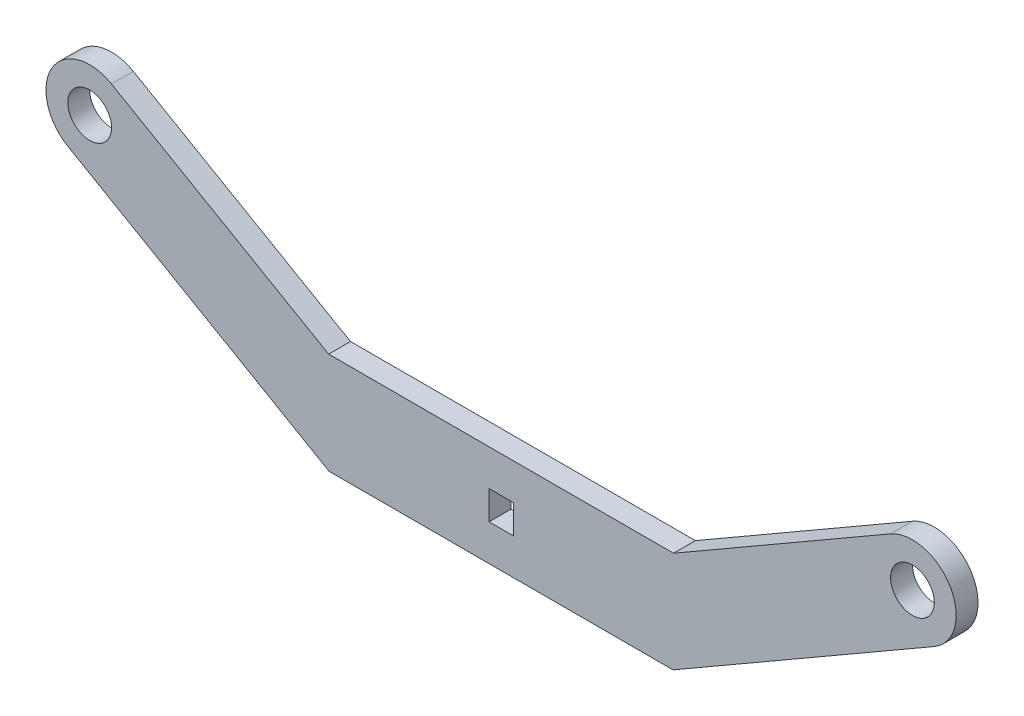
ISO-10303-21;
HEADER;
FILE_DESCRIPTION(('STEP AP214'),'2;1');
FILE_NAME('part.step','',(''),(''),'','','');
FILE_SCHEMA(('AUTOMOTIVE_DESIGN { 1 0 10303 214 1 1 1 1 }'));
ENDSEC;
DATA;
#1=APPLICATION_CONTEXT('core data for automotive mechanical design processes');
#2=APPLICATION_PROTOCOL_DEFINITION('international standard','automotive_design',2000,#1);
#3=PRODUCT_CONTEXT('',#1,'mechanical');
#4=PRODUCT('Part','Part','',(#3));
#5=PRODUCT_RELATED_PRODUCT_CATEGORY('part','',(#4));
#6=PRODUCT_DEFINITION_FORMATION('','',#4);
#7=PRODUCT_DEFINITION_CONTEXT('part definition',#1,'design');
#8=PRODUCT_DEFINITION('design','',#6,#7);
#9=PRODUCT_DEFINITION_SHAPE('','',#8);
#10=(LENGTH_UNIT() NAMED_UNIT(*) SI_UNIT(.MILLI.,.METRE.));
#11=(NAMED_UNIT(*) PLANE_ANGLE_UNIT() SI_UNIT($,.RADIAN.));
#12=(NAMED_UNIT(*) SI_UNIT($,.STERADIAN.) SOLID_ANGLE_UNIT());
#13=UNCERTAINTY_MEASURE_WITH_UNIT(LENGTH_MEASURE(1.E-05),#10,'distance_accuracy_value','');
#14=(GEOMETRIC_REPRESENTATION_CONTEXT(3) GLOBAL_UNCERTAINTY_ASSIGNED_CONTEXT((#13)) GLOBAL_UNIT_ASSIGNED_CONTEXT((#10,
#11,#12)) REPRESENTATION_CONTEXT('',''));
#15=CARTESIAN_POINT('',(0.,0.,0.));
#16=DIRECTION('',(0.,0.,1.));
#17=DIRECTION('',(1.,0.,0.));
#18=AXIS2_PLACEMENT_3D('',#15,#16,#17);
#19=CARTESIAN_POINT('',(238.96574,0.,6.35));
#20=DIRECTION('',(0.,0.,-1.));
#21=DIRECTION('',(-1.,0.,0.));
#22=AXIS2_PLACEMENT_3D('',#19,#20,#21);
#23=PLANE('',#22);
#24=DIRECTION('',(1.,0.,0.));
#25=VECTOR('',#24,1.);
#26=CARTESIAN_POINT('',(115.99663327226,-44.2802788400071,6.35));
#27=LINE('',#26,#25);
#28=CARTESIAN_POINT('',(115.99663327226,-44.2802788400071,6.35));
#29=VERTEX_POINT('',#28);
#30=CARTESIAN_POINT('',(123.105163057659,-44.2802788400071,6.35));
#31=VERTEX_POINT('',#30);
#32=EDGE_CURVE('E140',#29,#31,#27,.T.);
#33=ORIENTED_EDGE('',*,*,#32,.F.);
#34=DIRECTION('',(0.,-1.,0.));
#35=VECTOR('',#34,1.);
#36=CARTESIAN_POINT('',(115.99663327226,-44.2802788400071,6.35));
#37=LINE('',#36,#35);
#38=CARTESIAN_POINT('',(115.99663327226,-35.9276669935298,6.35));
#39=VERTEX_POINT('',#38);
#40=EDGE_CURVE('E47',#39,#29,#37,.T.);
#41=ORIENTED_EDGE('',*,*,#40,.F.);
#42=DIRECTION('',(-1.,0.,0.));
#43=VECTOR('',#42,1.);
#44=CARTESIAN_POINT('',(115.99663327226,-35.9276669935298,6.35));
#45=LINE('',#44,#43);
#46=CARTESIAN_POINT('',(123.105163057659,-35.9276669935298,6.35));
#47=VERTEX_POINT('',#46);
#48=EDGE_CURVE('E133',#47,#39,#45,.T.);
#49=ORIENTED_EDGE('',*,*,#48,.F.);
#50=DIRECTION('',(0.,1.,0.));
#51=VECTOR('',#50,1.);
#52=CARTESIAN_POINT('',(123.105163057659,-44.2802788400071,6.35));
#53=LINE('',#52,#51);
#54=EDGE_CURVE('E147',#31,#47,#53,.T.);
#55=ORIENTED_EDGE('',*,*,#54,.F.);
#56=EDGE_LOOP('',(#33,#41,#49,#55));
#57=FACE_BOUND('',#56,.T.);
#58=CARTESIAN_POINT('',(238.96574,0.,6.35));
#59=DIRECTION('',(0.,0.,1.));
#60=DIRECTION('',(-1.,0.,0.));
#61=AXIS2_PLACEMENT_3D('',#58,#59,#60);
#62=CIRCLE('',#61,12.7);
#63=CARTESIAN_POINT('',(245.31574,-10.9985226280624,6.35));
#64=VERTEX_POINT('',#63);
#65=CARTESIAN_POINT('',(232.61574,10.9985226280624,6.35));
#66=VERTEX_POINT('',#65);
#67=EDGE_CURVE('E168',#64,#66,#62,.T.);
#68=ORIENTED_EDGE('',*,*,#67,.T.);
#69=DIRECTION('',(-0.866025403784438,-0.500000000000001,0.));
#70=VECTOR('',#69,1.);
#71=CARTESIAN_POINT('',(232.61574,10.9985226280624,6.35));
#72=LINE('',#71,#70);
#73=CARTESIAN_POINT('',(169.571649487751,-25.4,6.35));
#74=VERTEX_POINT('',#73);
#75=EDGE_CURVE('E171',#66,#74,#72,.T.);
#76=ORIENTED_EDGE('',*,*,#75,.T.);
#77=DIRECTION('',(-1.,0.,0.));
#78=VECTOR('',#77,1.);
#79=CARTESIAN_POINT('',(69.3940905122494,-25.4,6.35));
#80=LINE('',#79,#78);
#81=CARTESIAN_POINT('',(69.3940905122494,-25.4,6.35));
#82=VERTEX_POINT('',#81);
#83=EDGE_CURVE('E174',#74,#82,#80,.T.);
#84=ORIENTED_EDGE('',*,*,#83,.T.);
#85=DIRECTION('',(-0.866025403784438,0.500000000000001,0.));
#86=VECTOR('',#85,1.);
#87=CARTESIAN_POINT('',(6.35000000000001,10.9985226280624,6.35));
#88=LINE('',#87,#86);
#89=CARTESIAN_POINT('',(6.35000000000001,10.9985226280624,6.35));
#90=VERTEX_POINT('',#89);
#91=EDGE_CURVE('E176',#82,#90,#88,.T.);
#92=ORIENTED_EDGE('',*,*,#91,.T.);
#93=CARTESIAN_POINT('',(0.,0.,6.35));
#94=DIRECTION('',(0.,0.,1.));
#95=DIRECTION('',(1.,0.,0.));
#96=AXIS2_PLACEMENT_3D('',#93,#94,#95);
#97=CIRCLE('',#96,12.7);
#98=CARTESIAN_POINT('',(-6.35000000000001,-10.9985226280624,6.35));
#99=VERTEX_POINT('',#98);
#100=EDGE_CURVE('E178',#90,#99,#97,.T.);
#101=ORIENTED_EDGE('',*,*,#100,.T.);
#102=DIRECTION('',(0.866025403784438,-0.500000000000001,0.));
#103=VECTOR('',#102,1.);
#104=CARTESIAN_POINT('',(-6.35000000000001,-10.9985226280624,6.35));
#105=LINE('',#104,#103);
#106=CARTESIAN_POINT('',(69.5301468421685,-54.8079458335368,6.35));
#107=VERTEX_POINT('',#106);
#108=EDGE_CURVE('E180',#99,#107,#105,.T.);
#109=ORIENTED_EDGE('',*,*,#108,.T.);
#110=DIRECTION('',(1.,0.,0.));
#111=VECTOR('',#110,1.);
#112=CARTESIAN_POINT('',(169.435593157831,-54.8079458335368,6.35));
#113=LINE('',#112,#111);
#114=CARTESIAN_POINT('',(169.435593157831,-54.8079458335368,6.35));
#115=VERTEX_POINT('',#114);
#116=EDGE_CURVE('E182',#107,#115,#113,.T.);
#117=ORIENTED_EDGE('',*,*,#116,.T.);
#118=DIRECTION('',(0.866025403784438,0.500000000000001,0.));
#119=VECTOR('',#118,1.);
#120=CARTESIAN_POINT('',(245.31574,-10.9985226280624,6.35));
#121=LINE('',#120,#119);
#122=EDGE_CURVE('E184',#115,#64,#121,.T.);
#123=ORIENTED_EDGE('',*,*,#122,.T.);
#124=EDGE_LOOP('',(#68,#76,#84,#92,#101,#109,#117,#123));
#125=FACE_BOUND('',#124,.T.);
#126=CARTESIAN_POINT('',(0.,0.,6.35));
#127=DIRECTION('',(0.,0.,1.));
#128=DIRECTION('',(1.,0.,0.));
#129=AXIS2_PLACEMENT_3D('',#126,#127,#128);
#130=CIRCLE('',#129,6.35);
#131=CARTESIAN_POINT('',(6.35,0.,6.35));
#132=VERTEX_POINT('',#131);
#133=EDGE_CURVE('E162',#132,#132,#130,.T.);
#134=ORIENTED_EDGE('',*,*,#133,.F.);
#135=EDGE_LOOP('',(#134));
#136=FACE_BOUND('',#135,.T.);
#137=CARTESIAN_POINT('',(238.96574,0.,6.35));
#138=DIRECTION('',(0.,0.,1.));
#139=DIRECTION('',(1.,0.,0.));
#140=AXIS2_PLACEMENT_3D('',#137,#138,#139);
#141=CIRCLE('',#140,6.35);
#142=CARTESIAN_POINT('',(245.31574,0.,6.35));
#143=VERTEX_POINT('',#142);
#144=EDGE_CURVE('E156',#143,#143,#141,.T.);
#145=ORIENTED_EDGE('',*,*,#144,.F.);
#146=EDGE_LOOP('',(#145));
#147=FACE_BOUND('',#146,.T.);
#148=ADVANCED_FACE('F32',(#57,#125,#136,#147),#23,.F.);
#149=CARTESIAN_POINT('',(238.96574,0.,0.));
#150=DIRECTION('',(0.,0.,-1.));
#151=DIRECTION('',(-1.,0.,0.));
#152=AXIS2_PLACEMENT_3D('',#149,#150,#151);
#153=PLANE('',#152);
#154=DIRECTION('',(0.,-1.,0.));
#155=VECTOR('',#154,1.);
#156=CARTESIAN_POINT('',(115.99663327226,-44.2802788400071,0.));
#157=LINE('',#156,#155);
#158=CARTESIAN_POINT('',(115.99663327226,-35.9276669935298,0.));
#159=VERTEX_POINT('',#158);
#160=CARTESIAN_POINT('',(115.99663327226,-44.2802788400071,0.));
#161=VERTEX_POINT('',#160);
#162=EDGE_CURVE('E131',#159,#161,#157,.T.);
#163=ORIENTED_EDGE('',*,*,#162,.T.);
#164=DIRECTION('',(1.,0.,0.));
#165=VECTOR('',#164,1.);
#166=CARTESIAN_POINT('',(115.99663327226,-44.2802788400071,0.));
#167=LINE('',#166,#165);
#168=CARTESIAN_POINT('',(123.105163057659,-44.2802788400071,0.));
#169=VERTEX_POINT('',#168);
#170=EDGE_CURVE('E120',#161,#169,#167,.T.);
#171=ORIENTED_EDGE('',*,*,#170,.T.);
#172=DIRECTION('',(0.,1.,0.));
#173=VECTOR('',#172,1.);
#174=CARTESIAN_POINT('',(123.105163057659,-44.2802788400071,0.));
#175=LINE('',#174,#173);
#176=CARTESIAN_POINT('',(123.105163057659,-35.9276669935298,0.));
#177=VERTEX_POINT('',#176);
#178=EDGE_CURVE('E142',#169,#177,#175,.T.);
#179=ORIENTED_EDGE('',*,*,#178,.T.);
#180=DIRECTION('',(-1.,0.,0.));
#181=VECTOR('',#180,1.);
#182=CARTESIAN_POINT('',(115.99663327226,-35.9276669935298,0.));
#183=LINE('',#182,#181);
#184=EDGE_CURVE('E138',#177,#159,#183,.T.);
#185=ORIENTED_EDGE('',*,*,#184,.T.);
#186=EDGE_LOOP('',(#163,#171,#179,#185));
#187=FACE_BOUND('',#186,.T.);
#188=CARTESIAN_POINT('',(0.,0.,0.));
#189=DIRECTION('',(0.,0.,1.));
#190=DIRECTION('',(1.,0.,0.));
#191=AXIS2_PLACEMENT_3D('',#188,#189,#190);
#192=CIRCLE('',#191,6.35);
#193=CARTESIAN_POINT('',(6.35,0.,0.));
#194=VERTEX_POINT('',#193);
#195=EDGE_CURVE('E159',#194,#194,#192,.T.);
#196=ORIENTED_EDGE('',*,*,#195,.T.);
#197=EDGE_LOOP('',(#196));
#198=FACE_BOUND('',#197,.T.);
#199=CARTESIAN_POINT('',(238.96574,0.,0.));
#200=DIRECTION('',(0.,0.,1.));
#201=DIRECTION('',(-1.,0.,0.));
#202=AXIS2_PLACEMENT_3D('',#199,#200,#201);
#203=CIRCLE('',#202,12.7);
#204=CARTESIAN_POINT('',(245.31574,-10.9985226280624,0.));
#205=VERTEX_POINT('',#204);
#206=CARTESIAN_POINT('',(232.61574,10.9985226280624,0.));
#207=VERTEX_POINT('',#206);
#208=EDGE_CURVE('E165',#205,#207,#203,.T.);
#209=ORIENTED_EDGE('',*,*,#208,.F.);
#210=DIRECTION('',(0.866025403784438,0.500000000000001,0.));
#211=VECTOR('',#210,1.);
#212=CARTESIAN_POINT('',(245.31574,-10.9985226280624,0.));
#213=LINE('',#212,#211);
#214=CARTESIAN_POINT('',(169.435593157831,-54.8079458335368,0.));
#215=VERTEX_POINT('',#214);
#216=EDGE_CURVE('E172',#215,#205,#213,.T.);
#217=ORIENTED_EDGE('',*,*,#216,.F.);
#218=DIRECTION('',(1.,0.,0.));
#219=VECTOR('',#218,1.);
#220=CARTESIAN_POINT('',(169.435593157831,-54.8079458335368,0.));
#221=LINE('',#220,#219);
#222=CARTESIAN_POINT('',(69.5301468421685,-54.8079458335368,0.));
#223=VERTEX_POINT('',#222);
#224=EDGE_CURVE('E199',#223,#215,#221,.T.);
#225=ORIENTED_EDGE('',*,*,#224,.F.);
#226=DIRECTION('',(0.866025403784438,-0.500000000000001,0.));
#227=VECTOR('',#226,1.);
#228=CARTESIAN_POINT('',(-6.35000000000001,-10.9985226280624,0.));
#229=LINE('',#228,#227);
#230=CARTESIAN_POINT('',(-6.35000000000001,-10.9985226280624,0.));
#231=VERTEX_POINT('',#230);
#232=EDGE_CURVE('E197',#231,#223,#229,.T.);
#233=ORIENTED_EDGE('',*,*,#232,.F.);
#234=CARTESIAN_POINT('',(0.,0.,0.));
#235=DIRECTION('',(0.,0.,1.));
#236=DIRECTION('',(1.,0.,0.));
#237=AXIS2_PLACEMENT_3D('',#234,#235,#236);
#238=CIRCLE('',#237,12.7);
#239=CARTESIAN_POINT('',(6.35000000000001,10.9985226280624,0.));
#240=VERTEX_POINT('',#239);
#241=EDGE_CURVE('E195',#240,#231,#238,.T.);
#242=ORIENTED_EDGE('',*,*,#241,.F.);
#243=DIRECTION('',(-0.866025403784438,0.500000000000001,0.));
#244=VECTOR('',#243,1.);
#245=CARTESIAN_POINT('',(6.35000000000001,10.9985226280624,0.));
#246=LINE('',#245,#244);
#247=CARTESIAN_POINT('',(69.3940905122494,-25.4,0.));
#248=VERTEX_POINT('',#247);
#249=EDGE_CURVE('E193',#248,#240,#246,.T.);
#250=ORIENTED_EDGE('',*,*,#249,.F.);
#251=DIRECTION('',(-1.,0.,0.));
#252=VECTOR('',#251,1.);
#253=CARTESIAN_POINT('',(69.3940905122494,-25.4,0.));
#254=LINE('',#253,#252);
#255=CARTESIAN_POINT('',(169.571649487751,-25.4,0.));
#256=VERTEX_POINT('',#255);
#257=EDGE_CURVE('E191',#256,#248,#254,.T.);
#258=ORIENTED_EDGE('',*,*,#257,.F.);
#259=DIRECTION('',(-0.866025403784438,-0.500000000000001,0.));
#260=VECTOR('',#259,1.);
#261=CARTESIAN_POINT('',(232.61574,10.9985226280624,0.));
#262=LINE('',#261,#260);
#263=EDGE_CURVE('E189',#207,#256,#262,.T.);
#264=ORIENTED_EDGE('',*,*,#263,.F.);
#265=EDGE_LOOP('',(#209,#217,#225,#233,#242,#250,#258,#264));
#266=FACE_BOUND('',#265,.T.);
#267=CARTESIAN_POINT('',(238.96574,0.,0.));
#268=DIRECTION('',(0.,0.,1.));
#269=DIRECTION('',(1.,0.,0.));
#270=AXIS2_PLACEMENT_3D('',#267,#268,#269);
#271=CIRCLE('',#270,6.35);
#272=CARTESIAN_POINT('',(245.31574,0.,0.));
#273=VERTEX_POINT('',#272);
#274=EDGE_CURVE('E127',#273,#273,#271,.T.);
#275=ORIENTED_EDGE('',*,*,#274,.T.);
#276=EDGE_LOOP('',(#275));
#277=FACE_BOUND('',#276,.T.);
#278=ADVANCED_FACE('F136',(#187,#198,#266,#277),#153,.T.);
#279=CARTESIAN_POINT('',(238.96574,0.,6.35));
#280=DIRECTION('',(0.,0.,-1.));
#281=DIRECTION('',(-1.,0.,0.));
#282=AXIS2_PLACEMENT_3D('',#279,#280,#281);
#283=CYLINDRICAL_SURFACE('',#282,12.7);
#284=ORIENTED_EDGE('',*,*,#208,.T.);
#285=DIRECTION('',(0.,0.,-1.));
#286=VECTOR('',#285,1.);
#287=CARTESIAN_POINT('',(232.61574,10.9985226280624,6.35));
#288=LINE('',#287,#286);
#289=EDGE_CURVE('E11',#66,#207,#288,.T.);
#290=ORIENTED_EDGE('',*,*,#289,.F.);
#291=ORIENTED_EDGE('',*,*,#67,.F.);
#292=DIRECTION('',(0.,0.,-1.));
#293=VECTOR('',#292,1.);
#294=CARTESIAN_POINT('',(245.31574,-10.9985226280624,6.35));
#295=LINE('',#294,#293);
#296=EDGE_CURVE('E186',#64,#205,#295,.T.);
#297=ORIENTED_EDGE('',*,*,#296,.T.);
#298=EDGE_LOOP('',(#284,#290,#291,#297));
#299=FACE_BOUND('',#298,.T.);
#300=ADVANCED_FACE('F34',(#299),#283,.T.);
#301=CARTESIAN_POINT('',(232.61574,10.9985226280624,6.35));
#302=DIRECTION('',(0.500000000000001,-0.866025403784438,0.));
#303=DIRECTION('',(0.866025403784438,0.500000000000001,0.));
#304=AXIS2_PLACEMENT_3D('',#301,#302,#303);
#305=PLANE('',#304);
#306=ORIENTED_EDGE('',*,*,#263,.T.);
#307=DIRECTION('',(0.,0.,-1.));
#308=VECTOR('',#307,1.);
#309=CARTESIAN_POINT('',(169.571649487751,-25.4,6.35));
#310=LINE('',#309,#308);
#311=EDGE_CURVE('E40',#74,#256,#310,.T.);
#312=ORIENTED_EDGE('',*,*,#311,.F.);
#313=ORIENTED_EDGE('',*,*,#75,.F.);
#314=ORIENTED_EDGE('',*,*,#289,.T.);
#315=EDGE_LOOP('',(#306,#312,#313,#314));
#316=FACE_BOUND('',#315,.T.);
#317=ADVANCED_FACE('F246',(#316),#305,.F.);
#318=CARTESIAN_POINT('',(69.3940905122494,-25.4,6.35));
#319=DIRECTION('',(0.,-1.,0.));
#320=DIRECTION('',(1.,0.,0.));
#321=AXIS2_PLACEMENT_3D('',#318,#319,#320);
#322=PLANE('',#321);
#323=ORIENTED_EDGE('',*,*,#257,.T.);
#324=DIRECTION('',(0.,0.,-1.));
#325=VECTOR('',#324,1.);
#326=CARTESIAN_POINT('',(69.3940905122494,-25.4,6.35));
#327=LINE('',#326,#325);
#328=EDGE_CURVE('E216',#82,#248,#327,.T.);
#329=ORIENTED_EDGE('',*,*,#328,.F.);
#330=ORIENTED_EDGE('',*,*,#83,.F.);
#331=ORIENTED_EDGE('',*,*,#311,.T.);
#332=EDGE_LOOP('',(#323,#329,#330,#331));
#333=FACE_BOUND('',#332,.T.);
#334=ADVANCED_FACE('F223',(#333),#322,.F.);
#335=CARTESIAN_POINT('',(6.35000000000001,10.9985226280624,6.35));
#336=DIRECTION('',(-0.500000000000001,-0.866025403784438,0.));
#337=DIRECTION('',(0.866025403784438,-0.500000000000001,0.));
#338=AXIS2_PLACEMENT_3D('',#335,#336,#337);
#339=PLANE('',#338);
#340=ORIENTED_EDGE('',*,*,#249,.T.);
#341=DIRECTION('',(0.,0.,-1.));
#342=VECTOR('',#341,1.);
#343=CARTESIAN_POINT('',(6.35000000000001,10.9985226280624,6.35));
#344=LINE('',#343,#342);
#345=EDGE_CURVE('E213',#90,#240,#344,.T.);
#346=ORIENTED_EDGE('',*,*,#345,.F.);
#347=ORIENTED_EDGE('',*,*,#91,.F.);
#348=ORIENTED_EDGE('',*,*,#328,.T.);
#349=EDGE_LOOP('',(#340,#346,#347,#348));
#350=FACE_BOUND('',#349,.T.);
#351=ADVANCED_FACE('F234',(#350),#339,.F.);
#352=CARTESIAN_POINT('',(0.,0.,6.35));
#353=DIRECTION('',(0.,0.,-1.));
#354=DIRECTION('',(-1.,0.,0.));
#355=AXIS2_PLACEMENT_3D('',#352,#353,#354);
#356=CYLINDRICAL_SURFACE('',#355,12.7);
#357=ORIENTED_EDGE('',*,*,#241,.T.);
#358=DIRECTION('',(0.,0.,-1.));
#359=VECTOR('',#358,1.);
#360=CARTESIAN_POINT('',(-6.35000000000001,-10.9985226280624,6.35));
#361=LINE('',#360,#359);
#362=EDGE_CURVE('E210',#99,#231,#361,.T.);
#363=ORIENTED_EDGE('',*,*,#362,.F.);
#364=ORIENTED_EDGE('',*,*,#100,.F.);
#365=ORIENTED_EDGE('',*,*,#345,.T.);
#366=EDGE_LOOP('',(#357,#363,#364,#365));
#367=FACE_BOUND('',#366,.T.);
#368=ADVANCED_FACE('F238',(#367),#356,.T.);
#369=CARTESIAN_POINT('',(-6.35000000000001,-10.9985226280624,6.35));
#370=DIRECTION('',(0.500000000000001,0.866025403784438,0.));
#371=DIRECTION('',(-0.866025403784438,0.500000000000001,0.));
#372=AXIS2_PLACEMENT_3D('',#369,#370,#371);
#373=PLANE('',#372);
#374=ORIENTED_EDGE('',*,*,#232,.T.);
#375=DIRECTION('',(0.,0.,-1.));
#376=VECTOR('',#375,1.);
#377=CARTESIAN_POINT('',(69.5301468421685,-54.8079458335368,6.35));
#378=LINE('',#377,#376);
#379=EDGE_CURVE('E207',#107,#223,#378,.T.);
#380=ORIENTED_EDGE('',*,*,#379,.F.);
#381=ORIENTED_EDGE('',*,*,#108,.F.);
#382=ORIENTED_EDGE('',*,*,#362,.T.);
#383=EDGE_LOOP('',(#374,#380,#381,#382));
#384=FACE_BOUND('',#383,.T.);
#385=ADVANCED_FACE('F259',(#384),#373,.F.);
#386=CARTESIAN_POINT('',(169.435593157831,-54.8079458335368,6.35));
#387=DIRECTION('',(0.,1.,0.));
#388=DIRECTION('',(-1.,0.,0.));
#389=AXIS2_PLACEMENT_3D('',#386,#387,#388);
#390=PLANE('',#389);
#391=ORIENTED_EDGE('',*,*,#224,.T.);
#392=DIRECTION('',(0.,0.,-1.));
#393=VECTOR('',#392,1.);
#394=CARTESIAN_POINT('',(169.435593157831,-54.8079458335368,6.35));
#395=LINE('',#394,#393);
#396=EDGE_CURVE('E204',#115,#215,#395,.T.);
#397=ORIENTED_EDGE('',*,*,#396,.F.);
#398=ORIENTED_EDGE('',*,*,#116,.F.);
#399=ORIENTED_EDGE('',*,*,#379,.T.);
#400=EDGE_LOOP('',(#391,#397,#398,#399));
#401=FACE_BOUND('',#400,.T.);
#402=ADVANCED_FACE('F257',(#401),#390,.F.);
#403=CARTESIAN_POINT('',(245.31574,-10.9985226280624,6.35));
#404=DIRECTION('',(-0.500000000000001,0.866025403784438,0.));
#405=DIRECTION('',(-0.866025403784438,-0.500000000000001,0.));
#406=AXIS2_PLACEMENT_3D('',#403,#404,#405);
#407=PLANE('',#406);
#408=ORIENTED_EDGE('',*,*,#216,.T.);
#409=ORIENTED_EDGE('',*,*,#296,.F.);
#410=ORIENTED_EDGE('',*,*,#122,.F.);
#411=ORIENTED_EDGE('',*,*,#396,.T.);
#412=EDGE_LOOP('',(#408,#409,#410,#411));
#413=FACE_BOUND('',#412,.T.);
#414=ADVANCED_FACE('F252',(#413),#407,.F.);
#415=CARTESIAN_POINT('',(0.,0.,6.35));
#416=DIRECTION('',(0.,0.,-1.));
#417=DIRECTION('',(-1.,0.,0.));
#418=AXIS2_PLACEMENT_3D('',#415,#416,#417);
#419=CYLINDRICAL_SURFACE('',#418,6.35);
#420=ORIENTED_EDGE('',*,*,#133,.T.);
#421=EDGE_LOOP('',(#420));
#422=FACE_BOUND('',#421,.T.);
#423=ORIENTED_EDGE('',*,*,#195,.F.);
#424=EDGE_LOOP('',(#423));
#425=FACE_BOUND('',#424,.T.);
#426=ADVANCED_FACE('F276',(#422,#425),#419,.F.);
#427=CARTESIAN_POINT('',(238.96574,0.,6.35));
#428=DIRECTION('',(0.,0.,-1.));
#429=DIRECTION('',(-1.,0.,0.));
#430=AXIS2_PLACEMENT_3D('',#427,#428,#429);
#431=CYLINDRICAL_SURFACE('',#430,6.35);
#432=ORIENTED_EDGE('',*,*,#144,.T.);
#433=EDGE_LOOP('',(#432));
#434=FACE_BOUND('',#433,.T.);
#435=ORIENTED_EDGE('',*,*,#274,.F.);
#436=EDGE_LOOP('',(#435));
#437=FACE_BOUND('',#436,.T.);
#438=ADVANCED_FACE('F283',(#434,#437),#431,.F.);
#439=CARTESIAN_POINT('',(115.99663327226,-44.2802788400071,-0.00100000000000013));
#440=DIRECTION('',(-1.,0.,0.));
#441=DIRECTION('',(0.,0.,1.));
#442=AXIS2_PLACEMENT_3D('',#439,#440,#441);
#443=PLANE('',#442);
#444=DIRECTION('',(0.,0.,1.));
#445=VECTOR('',#444,1.);
#446=CARTESIAN_POINT('',(115.99663327226,-35.9276669935298,-0.00100000000000013));
#447=LINE('',#446,#445);
#448=EDGE_CURVE('E128',#159,#39,#447,.T.);
#449=ORIENTED_EDGE('',*,*,#448,.T.);
#450=ORIENTED_EDGE('',*,*,#40,.T.);
#451=DIRECTION('',(0.,0.,1.));
#452=VECTOR('',#451,1.);
#453=CARTESIAN_POINT('',(115.99663327226,-44.2802788400071,-0.00100000000000013));
#454=LINE('',#453,#452);
#455=EDGE_CURVE('E122',#161,#29,#454,.T.);
#456=ORIENTED_EDGE('',*,*,#455,.F.);
#457=ORIENTED_EDGE('',*,*,#162,.F.);
#458=EDGE_LOOP('',(#449,#450,#456,#457));
#459=FACE_BOUND('',#458,.T.);
#460=ADVANCED_FACE('F130',(#459),#443,.F.);
#461=CARTESIAN_POINT('',(115.99663327226,-35.9276669935298,-0.00100000000000013));
#462=DIRECTION('',(0.,1.,0.));
#463=DIRECTION('',(0.,0.,1.));
#464=AXIS2_PLACEMENT_3D('',#461,#462,#463);
#465=PLANE('',#464);
#466=DIRECTION('',(0.,0.,1.));
#467=VECTOR('',#466,1.);
#468=CARTESIAN_POINT('',(123.105163057659,-35.9276669935298,-0.00100000000000013));
#469=LINE('',#468,#467);
#470=EDGE_CURVE('E153',#177,#47,#469,.T.);
#471=ORIENTED_EDGE('',*,*,#470,.T.);
#472=ORIENTED_EDGE('',*,*,#48,.T.);
#473=ORIENTED_EDGE('',*,*,#448,.F.);
#474=ORIENTED_EDGE('',*,*,#184,.F.);
#475=EDGE_LOOP('',(#471,#472,#473,#474));
#476=FACE_BOUND('',#475,.T.);
#477=ADVANCED_FACE('F299',(#476),#465,.F.);
#478=CARTESIAN_POINT('',(123.105163057659,-44.2802788400071,-0.00100000000000013));
#479=DIRECTION('',(1.,0.,0.));
#480=DIRECTION('',(0.,0.,-1.));
#481=AXIS2_PLACEMENT_3D('',#478,#479,#480);
#482=PLANE('',#481);
#483=DIRECTION('',(0.,0.,1.));
#484=VECTOR('',#483,1.);
#485=CARTESIAN_POINT('',(123.105163057659,-44.2802788400071,-0.00100000000000013));
#486=LINE('',#485,#484);
#487=EDGE_CURVE('E55',#169,#31,#486,.T.);
#488=ORIENTED_EDGE('',*,*,#487,.T.);
#489=ORIENTED_EDGE('',*,*,#54,.T.);
#490=ORIENTED_EDGE('',*,*,#470,.F.);
#491=ORIENTED_EDGE('',*,*,#178,.F.);
#492=EDGE_LOOP('',(#488,#489,#490,#491));
#493=FACE_BOUND('',#492,.T.);
#494=ADVANCED_FACE('F304',(#493),#482,.F.);
#495=CARTESIAN_POINT('',(115.99663327226,-44.2802788400071,-0.00100000000000013));
#496=DIRECTION('',(0.,-1.,0.));
#497=DIRECTION('',(0.,0.,-1.));
#498=AXIS2_PLACEMENT_3D('',#495,#496,#497);
#499=PLANE('',#498);
#500=ORIENTED_EDGE('',*,*,#455,.T.);
#501=ORIENTED_EDGE('',*,*,#32,.T.);
#502=ORIENTED_EDGE('',*,*,#487,.F.);
#503=ORIENTED_EDGE('',*,*,#170,.F.);
#504=EDGE_LOOP('',(#500,#501,#502,#503));
#505=FACE_BOUND('',#504,.T.);
#506=ADVANCED_FACE('F121',(#505),#499,.F.);
#507=CLOSED_SHELL('',(#148,#278,#300,#317,#334,#351,#368,#385,#402,#414,#426,#438,#460,#477,
#494,#506));
#508=MANIFOLD_SOLID_BREP('B2',#507);
#509=ADVANCED_BREP_SHAPE_REPRESENTATION('',(#18,#508),#14);
#510=SHAPE_DEFINITION_REPRESENTATION(#9,#509);
ENDSEC;
END-ISO-10303-21;
